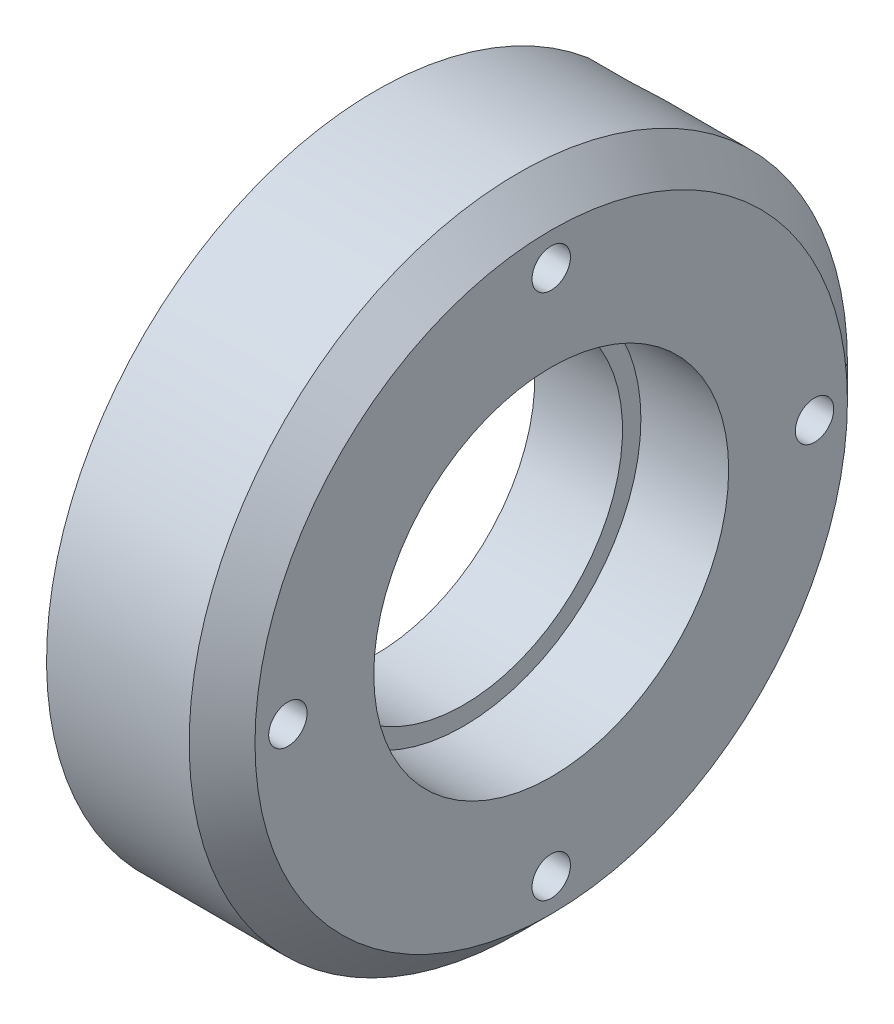
ISO-10303-21;
HEADER;
FILE_DESCRIPTION(('STEP AP214'),'2;1');
FILE_NAME('part.step','',(''),(''),'','','');
FILE_SCHEMA(('AUTOMOTIVE_DESIGN { 1 0 10303 214 1 1 1 1 }'));
ENDSEC;
DATA;
#1=APPLICATION_CONTEXT('core data for automotive mechanical design processes');
#2=APPLICATION_PROTOCOL_DEFINITION('international standard','automotive_design',2000,#1);
#3=PRODUCT_CONTEXT('',#1,'mechanical');
#4=PRODUCT('Part','Part','',(#3));
#5=PRODUCT_RELATED_PRODUCT_CATEGORY('part','',(#4));
#6=PRODUCT_DEFINITION_FORMATION('','',#4);
#7=PRODUCT_DEFINITION_CONTEXT('part definition',#1,'design');
#8=PRODUCT_DEFINITION('design','',#6,#7);
#9=PRODUCT_DEFINITION_SHAPE('','',#8);
#10=(LENGTH_UNIT() NAMED_UNIT(*) SI_UNIT(.MILLI.,.METRE.));
#11=(NAMED_UNIT(*) PLANE_ANGLE_UNIT() SI_UNIT($,.RADIAN.));
#12=(NAMED_UNIT(*) SI_UNIT($,.STERADIAN.) SOLID_ANGLE_UNIT());
#13=UNCERTAINTY_MEASURE_WITH_UNIT(LENGTH_MEASURE(1.E-05),#10,'distance_accuracy_value','');
#14=(GEOMETRIC_REPRESENTATION_CONTEXT(3) GLOBAL_UNCERTAINTY_ASSIGNED_CONTEXT((#13)) GLOBAL_UNIT_ASSIGNED_CONTEXT((#10,
#11,#12)) REPRESENTATION_CONTEXT('',''));
#15=CARTESIAN_POINT('',(0.,0.,0.));
#16=DIRECTION('',(0.,0.,1.));
#17=DIRECTION('',(1.,0.,0.));
#18=AXIS2_PLACEMENT_3D('',#15,#16,#17);
#19=CARTESIAN_POINT('',(40.,0.,0.));
#20=DIRECTION('',(-1.,0.,0.));
#21=DIRECTION('',(0.,0.,1.));
#22=AXIS2_PLACEMENT_3D('',#19,#20,#21);
#23=CYLINDRICAL_SURFACE('',#22,16.175);
#24=CARTESIAN_POINT('',(30.,0.,0.));
#25=DIRECTION('',(1.,0.,0.));
#26=DIRECTION('',(0.,0.,-1.));
#27=AXIS2_PLACEMENT_3D('',#24,#25,#26);
#28=CIRCLE('',#27,16.175);
#29=CARTESIAN_POINT('',(30.,0.,-16.175));
#30=VERTEX_POINT('',#29);
#31=EDGE_CURVE('E161',#30,#30,#28,.T.);
#32=ORIENTED_EDGE('',*,*,#31,.T.);
#33=EDGE_LOOP('',(#32));
#34=FACE_BOUND('',#33,.T.);
#35=CARTESIAN_POINT('',(22.,0.,0.));
#36=DIRECTION('',(-1.,0.,0.));
#37=DIRECTION('',(0.,0.,1.));
#38=AXIS2_PLACEMENT_3D('',#35,#36,#37);
#39=CIRCLE('',#38,16.175);
#40=CARTESIAN_POINT('',(22.,0.,16.175));
#41=VERTEX_POINT('',#40);
#42=EDGE_CURVE('E164',#41,#41,#39,.T.);
#43=ORIENTED_EDGE('',*,*,#42,.T.);
#44=EDGE_LOOP('',(#43));
#45=FACE_BOUND('',#44,.T.);
#46=ADVANCED_FACE('F36',(#34,#45),#23,.F.);
#47=CARTESIAN_POINT('',(40.,0.,0.));
#48=DIRECTION('',(-1.,0.,0.));
#49=DIRECTION('',(0.,0.,1.));
#50=AXIS2_PLACEMENT_3D('',#47,#48,#49);
#51=CYLINDRICAL_SURFACE('',#50,30.);
#52=CARTESIAN_POINT('',(27.,0.,0.));
#53=DIRECTION('',(1.,0.,0.));
#54=DIRECTION('',(0.,0.,-1.));
#55=AXIS2_PLACEMENT_3D('',#52,#53,#54);
#56=CIRCLE('',#55,30.);
#57=CARTESIAN_POINT('',(27.,0.,-30.));
#58=VERTEX_POINT('',#57);
#59=EDGE_CURVE('E181',#58,#58,#56,.F.);
#60=ORIENTED_EDGE('',*,*,#59,.T.);
#61=EDGE_LOOP('',(#60));
#62=FACE_BOUND('',#61,.T.);
#63=CARTESIAN_POINT('',(17.,19.3716512036432,-22.9071851095762));
#64=CARTESIAN_POINT('',(17.0701850028205,19.3716446278736,-22.9071882612013));
#65=CARTESIAN_POINT('',(17.1403666451784,19.3739158061036,-22.9052699670452));
#66=CARTESIAN_POINT('',(17.2802254251884,19.3829633677482,-22.8976154956787));
#67=CARTESIAN_POINT('',(17.3499025932304,19.3897394774612,-22.8918795504134));
#68=CARTESIAN_POINT('',(17.488204811399,19.4077390000801,-22.8766212312019));
#69=CARTESIAN_POINT('',(17.5568307010772,19.4189586489199,-22.8671020619533));
#70=CARTESIAN_POINT('',(17.692582006056,19.4457340512329,-22.8443370022947));
#71=CARTESIAN_POINT('',(17.7597074354787,19.461289763877,-22.8310911469758));
#72=CARTESIAN_POINT('',(17.958176286823,19.5142946363563,-22.7858398679566));
#73=CARTESIAN_POINT('',(18.0866795718545,19.558090382794,-22.7483133061746));
#74=CARTESIAN_POINT('',(18.3321204045051,19.6610253195139,-22.6594059003465));
#75=CARTESIAN_POINT('',(18.4490596101257,19.7201623058258,-22.6080270463223));
#76=CARTESIAN_POINT('',(18.6684535033983,19.8519484215111,-22.4923948201138));
#77=CARTESIAN_POINT('',(18.7708759560693,19.9246268173443,-22.4281135387689));
#78=CARTESIAN_POINT('',(18.9580391716107,20.0810170367262,-22.2881973535121));
#79=CARTESIAN_POINT('',(19.0427772421965,20.1647305371074,-22.212560723862));
#80=CARTESIAN_POINT('',(19.1922684232088,20.3406153462669,-22.0516116374863));
#81=CARTESIAN_POINT('',(19.2569929453064,20.4327985121099,-21.9662855754415));
#82=CARTESIAN_POINT('',(19.3644314414138,20.6226144437533,-21.7881778201045));
#83=CARTESIAN_POINT('',(19.4071471375001,20.7202467825215,-21.695396710788));
#84=CARTESIAN_POINT('',(19.4692657976302,20.9177510057369,-21.5050331520324));
#85=CARTESIAN_POINT('',(19.4887226929871,21.017617160124,-21.40746235822));
#86=CARTESIAN_POINT('',(19.5039381179809,21.2168660114761,-21.2100039112322));
#87=CARTESIAN_POINT('',(19.4996965066672,21.3162487055622,-21.1101162442804));
#88=CARTESIAN_POINT('',(19.4676786321492,21.5114691556099,-20.9111472171078));
#89=CARTESIAN_POINT('',(19.4399610520706,21.607315129476,-20.812064467769));
#90=CARTESIAN_POINT('',(19.3618693723679,21.7931453845252,-20.6173939787849));
#91=CARTESIAN_POINT('',(19.3114951651937,21.8831296378806,-20.5218062557326));
#92=CARTESIAN_POINT('',(19.1894536687989,22.0550461552047,-20.3369346456644));
#93=CARTESIAN_POINT('',(19.1177596639948,22.1369681439988,-20.2476588428089));
#94=CARTESIAN_POINT('',(18.9551363557716,22.290639120905,-20.0783589711186));
#95=CARTESIAN_POINT('',(18.8642075449676,22.3623883694684,-19.9983346654285));
#96=CARTESIAN_POINT('',(18.6653797667402,22.4942473319602,-19.8499053680517));
#97=CARTESIAN_POINT('',(18.5574322089235,22.5543225839599,-19.781534849487));
#98=CARTESIAN_POINT('',(18.3277541651145,22.6612412431664,-19.6589619502575));
#99=CARTESIAN_POINT('',(18.2060194470616,22.7080805720142,-19.6047639369217));
#100=CARTESIAN_POINT('',(17.9521725957926,22.7875056469189,-19.512388753679));
#101=CARTESIAN_POINT('',(17.8200530455419,22.8200810943189,-19.4742231601355));
#102=CARTESIAN_POINT('',(17.5493501086506,22.8701905933769,-19.4153522171289));
#103=CARTESIAN_POINT('',(17.4107768653433,22.887747461102,-19.3946203832984));
#104=CARTESIAN_POINT('',(17.2260404539781,22.9008177417525,-19.3791783903615));
#105=CARTESIAN_POINT('',(17.1808715626238,22.9032069543493,-19.3763545036907));
#106=CARTESIAN_POINT('',(17.0904746702237,22.9063884606105,-19.3725934553239));
#107=CARTESIAN_POINT('',(17.0452468933681,22.9071834107215,-19.3716531550971));
#108=CARTESIAN_POINT('',(17.,22.907185109576,-19.3716512036435));
#109=B_SPLINE_CURVE_WITH_KNOTS('',3,(#63,#64,#65,#66,#67,#68,#69,#70,#71,#72,#73,#74,#75,#76,
#77,#78,#79,#80,#81,#82,#83,#84,#85,#86,#87,#88,#89,#90,#91,#92,#93,#94,#95,#96,#97,#98,#99,
#100,#101,#102,#103,#104,#105,#106,#107,#108),.UNSPECIFIED.,.F.,.F.,(4,2,2,2,2,2,2,2,2,2,2,2,2,
2,2,2,2,2,2,2,2,2,4),(0.,0.210486047255995,0.420959307396837,0.631254658321439,
0.841548029138379,1.26193249701665,1.68225660456235,2.10349990553541,2.52480729022185,
2.94671374001897,3.36858717281008,3.78948047781996,4.21037628615937,4.63022307147192,
5.05007184979883,5.47044896860687,5.89081532260681,6.31240436055815,6.73412316061267,
7.15614594555505,7.57752645352452,7.71343882322753,7.84912453957709),.UNSPECIFIED.);
#110=CARTESIAN_POINT('',(17.,19.3716512036432,-22.9071851095762));
#111=VERTEX_POINT('',#110);
#112=CARTESIAN_POINT('',(17.,22.907185109576,-19.3716512036435));
#113=VERTEX_POINT('',#112);
#114=EDGE_CURVE('E83',#111,#113,#109,.T.);
#115=ORIENTED_EDGE('',*,*,#114,.T.);
#116=DIRECTION('',(-1.,0.,0.));
#117=VECTOR('',#116,1.);
#118=CARTESIAN_POINT('',(40.,22.907185109576,-19.3716512036435));
#119=LINE('',#118,#117);
#120=CARTESIAN_POINT('',(14.,22.907185109576,-19.3716512036435));
#121=VERTEX_POINT('',#120);
#122=EDGE_CURVE('E90',#113,#121,#119,.T.);
#123=ORIENTED_EDGE('',*,*,#122,.T.);
#124=CARTESIAN_POINT('',(14.,0.,0.));
#125=DIRECTION('',(-1.,0.,0.));
#126=DIRECTION('',(0.,0.,1.));
#127=AXIS2_PLACEMENT_3D('',#124,#125,#126);
#128=CIRCLE('',#127,30.);
#129=CARTESIAN_POINT('',(14.,19.3716512036432,-22.9071851095762));
#130=VERTEX_POINT('',#129);
#131=EDGE_CURVE('E99',#130,#121,#128,.T.);
#132=ORIENTED_EDGE('',*,*,#131,.F.);
#133=DIRECTION('',(-1.,0.,0.));
#134=VECTOR('',#133,1.);
#135=CARTESIAN_POINT('',(40.,19.3716512036432,-22.9071851095762));
#136=LINE('',#135,#134);
#137=EDGE_CURVE('E56',#130,#111,#136,.F.);
#138=ORIENTED_EDGE('',*,*,#137,.T.);
#139=EDGE_LOOP('',(#115,#123,#132,#138));
#140=FACE_BOUND('',#139,.T.);
#141=ADVANCED_FACE('F97',(#62,#140),#51,.T.);
#142=CARTESIAN_POINT('',(5.,0.,24.));
#143=DIRECTION('',(1.,0.,0.));
#144=DIRECTION('',(0.,0.,-1.));
#145=AXIS2_PLACEMENT_3D('',#142,#143,#144);
#146=CYLINDRICAL_SURFACE('',#145,1.75);
#147=CARTESIAN_POINT('',(30.,0.,24.));
#148=DIRECTION('',(1.,0.,0.));
#149=DIRECTION('',(0.,0.,-1.));
#150=AXIS2_PLACEMENT_3D('',#147,#148,#149);
#151=CIRCLE('',#150,1.75);
#152=CARTESIAN_POINT('',(30.,0.,22.25));
#153=VERTEX_POINT('',#152);
#154=EDGE_CURVE('E198',#153,#153,#151,.T.);
#155=CARTESIAN_POINT('',(14.,0.,24.));
#156=DIRECTION('',(-1.,0.,0.));
#157=DIRECTION('',(0.,0.,1.));
#158=AXIS2_PLACEMENT_3D('',#155,#156,#157);
#159=CIRCLE('',#158,1.75);
#160=CARTESIAN_POINT('',(14.,0.,22.25));
#161=VERTEX_POINT('',#160);
#162=EDGE_CURVE('E206',#161,#161,#159,.T.);
#163=CARTESIAN_POINT('',(30.,0.,22.25));
#164=CARTESIAN_POINT('',(29.8333333333333,0.,22.25));
#165=CARTESIAN_POINT('',(29.6666666666667,0.,22.25));
#166=CARTESIAN_POINT('',(29.3333333333333,0.,22.25));
#167=CARTESIAN_POINT('',(29.1666666666667,0.,22.25));
#168=CARTESIAN_POINT('',(28.8333333333333,0.,22.25));
#169=CARTESIAN_POINT('',(28.6666666666667,0.,22.25));
#170=CARTESIAN_POINT('',(28.3333333333333,0.,22.25));
#171=CARTESIAN_POINT('',(28.1666666666667,0.,22.25));
#172=CARTESIAN_POINT('',(27.8333333333333,0.,22.25));
#173=CARTESIAN_POINT('',(27.6666666666667,0.,22.25));
#174=CARTESIAN_POINT('',(27.3333333333333,0.,22.25));
#175=CARTESIAN_POINT('',(27.1666666666667,0.,22.25));
#176=CARTESIAN_POINT('',(26.8333333333333,0.,22.25));
#177=CARTESIAN_POINT('',(26.6666666666667,0.,22.25));
#178=CARTESIAN_POINT('',(26.3333333333333,0.,22.25));
#179=CARTESIAN_POINT('',(26.1666666666667,0.,22.25));
#180=CARTESIAN_POINT('',(25.8333333333333,0.,22.25));
#181=CARTESIAN_POINT('',(25.6666666666667,0.,22.25));
#182=CARTESIAN_POINT('',(25.3333333333333,0.,22.25));
#183=CARTESIAN_POINT('',(25.1666666666667,0.,22.25));
#184=CARTESIAN_POINT('',(24.8333333333333,0.,22.25));
#185=CARTESIAN_POINT('',(24.6666666666667,0.,22.25));
#186=CARTESIAN_POINT('',(24.3333333333333,0.,22.25));
#187=CARTESIAN_POINT('',(24.1666666666667,0.,22.25));
#188=CARTESIAN_POINT('',(23.8333333333333,0.,22.25));
#189=CARTESIAN_POINT('',(23.6666666666667,0.,22.25));
#190=CARTESIAN_POINT('',(23.3333333333333,0.,22.25));
#191=CARTESIAN_POINT('',(23.1666666666667,0.,22.25));
#192=CARTESIAN_POINT('',(22.8333333333333,0.,22.25));
#193=CARTESIAN_POINT('',(22.6666666666667,0.,22.25));
#194=CARTESIAN_POINT('',(22.3333333333333,0.,22.25));
#195=CARTESIAN_POINT('',(22.1666666666667,0.,22.25));
#196=CARTESIAN_POINT('',(21.8333333333333,0.,22.25));
#197=CARTESIAN_POINT('',(21.6666666666667,0.,22.25));
#198=CARTESIAN_POINT('',(21.3333333333333,0.,22.25));
#199=CARTESIAN_POINT('',(21.1666666666667,0.,22.25));
#200=CARTESIAN_POINT('',(20.8333333333333,0.,22.25));
#201=CARTESIAN_POINT('',(20.6666666666667,0.,22.25));
#202=CARTESIAN_POINT('',(20.3333333333333,0.,22.25));
#203=CARTESIAN_POINT('',(20.1666666666667,0.,22.25));
#204=CARTESIAN_POINT('',(19.8333333333333,0.,22.25));
#205=CARTESIAN_POINT('',(19.6666666666667,0.,22.25));
#206=CARTESIAN_POINT('',(19.3333333333333,0.,22.25));
#207=CARTESIAN_POINT('',(19.1666666666667,0.,22.25));
#208=CARTESIAN_POINT('',(18.8333333333333,0.,22.25));
#209=CARTESIAN_POINT('',(18.6666666666667,0.,22.25));
#210=CARTESIAN_POINT('',(18.3333333333333,0.,22.25));
#211=CARTESIAN_POINT('',(18.1666666666667,0.,22.25));
#212=CARTESIAN_POINT('',(17.8333333333333,0.,22.25));
#213=CARTESIAN_POINT('',(17.6666666666667,0.,22.25));
#214=CARTESIAN_POINT('',(17.3333333333333,0.,22.25));
#215=CARTESIAN_POINT('',(17.1666666666667,0.,22.25));
#216=CARTESIAN_POINT('',(16.8333333333333,0.,22.25));
#217=CARTESIAN_POINT('',(16.6666666666667,0.,22.25));
#218=CARTESIAN_POINT('',(16.3333333333333,0.,22.25));
#219=CARTESIAN_POINT('',(16.1666666666667,0.,22.25));
#220=CARTESIAN_POINT('',(15.8333333333333,0.,22.25));
#221=CARTESIAN_POINT('',(15.6666666666667,0.,22.25));
#222=CARTESIAN_POINT('',(15.3333333333333,0.,22.25));
#223=CARTESIAN_POINT('',(15.1666666666667,0.,22.25));
#224=CARTESIAN_POINT('',(14.8333333333333,0.,22.25));
#225=CARTESIAN_POINT('',(14.6666666666667,0.,22.25));
#226=CARTESIAN_POINT('',(14.3333333333333,0.,22.25));
#227=CARTESIAN_POINT('',(14.1666666666667,0.,22.25));
#228=CARTESIAN_POINT('',(14.,0.,22.25));
#229=B_SPLINE_CURVE_WITH_KNOTS('',3,(#163,#164,#165,#166,#167,#168,#169,#170,#171,#172,#173,
#174,#175,#176,#177,#178,#179,#180,#181,#182,#183,#184,#185,#186,#187,#188,#189,#190,#191,#192,
#193,#194,#195,#196,#197,#198,#199,#200,#201,#202,#203,#204,#205,#206,#207,#208,#209,#210,#211,
#212,#213,#214,#215,#216,#217,#218,#219,#220,#221,#222,#223,#224,#225,#226,#227,#228),
.UNSPECIFIED.,.F.,.F.,(4,2,2,2,2,2,2,2,2,2,2,2,2,2,2,2,2,2,2,2,2,2,2,2,2,2,2,2,2,2,2,2,4),(0.,
0.5,1.,1.5,2.,2.5,3.,3.5,4.,4.5,5.,5.5,6.,6.5,7.,7.5,8.,8.5,9.,9.49999999999999,
9.99999999999999,10.5,11.,11.5,12.,12.5,13.,13.5,14.,14.5,15.,15.5,16.),.UNSPECIFIED.);
#230=EDGE_CURVE('BSEAM145',#153,#161,#229,.T.);
#231=ORIENTED_EDGE('',*,*,#154,.T.);
#232=ORIENTED_EDGE('',*,*,#162,.T.);
#233=ORIENTED_EDGE('',*,*,#230,.T.);
#234=ORIENTED_EDGE('',*,*,#230,.F.);
#235=EDGE_LOOP('',(#231,#233,#232,#234));
#236=FACE_BOUND('',#235,.T.);
#237=ADVANCED_FACE('F145',(#236),#146,.F.);
#238=CARTESIAN_POINT('',(5.,24.,0.));
#239=DIRECTION('',(1.,0.,0.));
#240=DIRECTION('',(0.,0.,-1.));
#241=AXIS2_PLACEMENT_3D('',#238,#239,#240);
#242=CYLINDRICAL_SURFACE('',#241,1.75);
#243=CARTESIAN_POINT('',(30.,24.,0.));
#244=DIRECTION('',(1.,0.,0.));
#245=DIRECTION('',(0.,0.,-1.));
#246=AXIS2_PLACEMENT_3D('',#243,#244,#245);
#247=CIRCLE('',#246,1.75);
#248=CARTESIAN_POINT('',(30.,24.,-1.75000000000008));
#249=VERTEX_POINT('',#248);
#250=EDGE_CURVE('E196',#249,#249,#247,.T.);
#251=CARTESIAN_POINT('',(14.,24.,0.));
#252=DIRECTION('',(-1.,0.,0.));
#253=DIRECTION('',(0.,0.,1.));
#254=AXIS2_PLACEMENT_3D('',#251,#252,#253);
#255=CIRCLE('',#254,1.75);
#256=CARTESIAN_POINT('',(14.,24.,-1.75000000000008));
#257=VERTEX_POINT('',#256);
#258=EDGE_CURVE('E207',#257,#257,#255,.T.);
#259=CARTESIAN_POINT('',(30.,24.,-1.75000000000008));
#260=CARTESIAN_POINT('',(29.8333333333333,24.,-1.75000000000008));
#261=CARTESIAN_POINT('',(29.6666666666667,24.,-1.75000000000008));
#262=CARTESIAN_POINT('',(29.3333333333333,24.,-1.75000000000008));
#263=CARTESIAN_POINT('',(29.1666666666667,24.,-1.75000000000008));
#264=CARTESIAN_POINT('',(28.8333333333333,24.,-1.75000000000008));
#265=CARTESIAN_POINT('',(28.6666666666667,24.,-1.75000000000008));
#266=CARTESIAN_POINT('',(28.3333333333333,24.,-1.75000000000008));
#267=CARTESIAN_POINT('',(28.1666666666667,24.,-1.75000000000008));
#268=CARTESIAN_POINT('',(27.8333333333333,24.,-1.75000000000008));
#269=CARTESIAN_POINT('',(27.6666666666667,24.,-1.75000000000008));
#270=CARTESIAN_POINT('',(27.3333333333333,24.,-1.75000000000008));
#271=CARTESIAN_POINT('',(27.1666666666667,24.,-1.75000000000008));
#272=CARTESIAN_POINT('',(26.8333333333333,24.,-1.75000000000008));
#273=CARTESIAN_POINT('',(26.6666666666667,24.,-1.75000000000008));
#274=CARTESIAN_POINT('',(26.3333333333333,24.,-1.75000000000008));
#275=CARTESIAN_POINT('',(26.1666666666667,24.,-1.75000000000008));
#276=CARTESIAN_POINT('',(25.8333333333333,24.,-1.75000000000008));
#277=CARTESIAN_POINT('',(25.6666666666667,24.,-1.75000000000008));
#278=CARTESIAN_POINT('',(25.3333333333333,24.,-1.75000000000008));
#279=CARTESIAN_POINT('',(25.1666666666667,24.,-1.75000000000008));
#280=CARTESIAN_POINT('',(24.8333333333333,24.,-1.75000000000008));
#281=CARTESIAN_POINT('',(24.6666666666667,24.,-1.75000000000008));
#282=CARTESIAN_POINT('',(24.3333333333333,24.,-1.75000000000008));
#283=CARTESIAN_POINT('',(24.1666666666667,24.,-1.75000000000008));
#284=CARTESIAN_POINT('',(23.8333333333333,24.,-1.75000000000008));
#285=CARTESIAN_POINT('',(23.6666666666667,24.,-1.75000000000008));
#286=CARTESIAN_POINT('',(23.3333333333333,24.,-1.75000000000008));
#287=CARTESIAN_POINT('',(23.1666666666667,24.,-1.75000000000008));
#288=CARTESIAN_POINT('',(22.8333333333333,24.,-1.75000000000008));
#289=CARTESIAN_POINT('',(22.6666666666667,24.,-1.75000000000008));
#290=CARTESIAN_POINT('',(22.3333333333333,24.,-1.75000000000008));
#291=CARTESIAN_POINT('',(22.1666666666667,24.,-1.75000000000008));
#292=CARTESIAN_POINT('',(21.8333333333333,24.,-1.75000000000008));
#293=CARTESIAN_POINT('',(21.6666666666667,24.,-1.75000000000008));
#294=CARTESIAN_POINT('',(21.3333333333333,24.,-1.75000000000008));
#295=CARTESIAN_POINT('',(21.1666666666667,24.,-1.75000000000008));
#296=CARTESIAN_POINT('',(20.8333333333333,24.,-1.75000000000008));
#297=CARTESIAN_POINT('',(20.6666666666667,24.,-1.75000000000008));
#298=CARTESIAN_POINT('',(20.3333333333333,24.,-1.75000000000008));
#299=CARTESIAN_POINT('',(20.1666666666667,24.,-1.75000000000008));
#300=CARTESIAN_POINT('',(19.8333333333333,24.,-1.75000000000008));
#301=CARTESIAN_POINT('',(19.6666666666667,24.,-1.75000000000008));
#302=CARTESIAN_POINT('',(19.3333333333333,24.,-1.75000000000008));
#303=CARTESIAN_POINT('',(19.1666666666667,24.,-1.75000000000008));
#304=CARTESIAN_POINT('',(18.8333333333333,24.,-1.75000000000008));
#305=CARTESIAN_POINT('',(18.6666666666667,24.,-1.75000000000008));
#306=CARTESIAN_POINT('',(18.3333333333333,24.,-1.75000000000008));
#307=CARTESIAN_POINT('',(18.1666666666667,24.,-1.75000000000008));
#308=CARTESIAN_POINT('',(17.8333333333333,24.,-1.75000000000008));
#309=CARTESIAN_POINT('',(17.6666666666667,24.,-1.75000000000008));
#310=CARTESIAN_POINT('',(17.3333333333333,24.,-1.75000000000008));
#311=CARTESIAN_POINT('',(17.1666666666667,24.,-1.75000000000008));
#312=CARTESIAN_POINT('',(16.8333333333333,24.,-1.75000000000008));
#313=CARTESIAN_POINT('',(16.6666666666667,24.,-1.75000000000008));
#314=CARTESIAN_POINT('',(16.3333333333333,24.,-1.75000000000008));
#315=CARTESIAN_POINT('',(16.1666666666667,24.,-1.75000000000008));
#316=CARTESIAN_POINT('',(15.8333333333333,24.,-1.75000000000008));
#317=CARTESIAN_POINT('',(15.6666666666667,24.,-1.75000000000008));
#318=CARTESIAN_POINT('',(15.3333333333333,24.,-1.75000000000008));
#319=CARTESIAN_POINT('',(15.1666666666667,24.,-1.75000000000008));
#320=CARTESIAN_POINT('',(14.8333333333333,24.,-1.75000000000008));
#321=CARTESIAN_POINT('',(14.6666666666667,24.,-1.75000000000008));
#322=CARTESIAN_POINT('',(14.3333333333333,24.,-1.75000000000008));
#323=CARTESIAN_POINT('',(14.1666666666667,24.,-1.75000000000008));
#324=CARTESIAN_POINT('',(14.,24.,-1.75000000000008));
#325=B_SPLINE_CURVE_WITH_KNOTS('',3,(#259,#260,#261,#262,#263,#264,#265,#266,#267,#268,#269,
#270,#271,#272,#273,#274,#275,#276,#277,#278,#279,#280,#281,#282,#283,#284,#285,#286,#287,#288,
#289,#290,#291,#292,#293,#294,#295,#296,#297,#298,#299,#300,#301,#302,#303,#304,#305,#306,#307,
#308,#309,#310,#311,#312,#313,#314,#315,#316,#317,#318,#319,#320,#321,#322,#323,#324),
.UNSPECIFIED.,.F.,.F.,(4,2,2,2,2,2,2,2,2,2,2,2,2,2,2,2,2,2,2,2,2,2,2,2,2,2,2,2,2,2,2,2,4),(0.,
0.5,1.,1.5,2.,2.5,3.,3.5,4.,4.5,5.,5.5,6.,6.5,7.,7.5,8.,8.5,9.,9.49999999999999,
9.99999999999999,10.5,11.,11.5,12.,12.5,13.,13.5,14.,14.5,15.,15.5,16.),.UNSPECIFIED.);
#326=EDGE_CURVE('BSEAM141',#249,#257,#325,.T.);
#327=ORIENTED_EDGE('',*,*,#250,.T.);
#328=ORIENTED_EDGE('',*,*,#258,.T.);
#329=ORIENTED_EDGE('',*,*,#326,.T.);
#330=ORIENTED_EDGE('',*,*,#326,.F.);
#331=EDGE_LOOP('',(#327,#329,#328,#330));
#332=FACE_BOUND('',#331,.T.);
#333=ADVANCED_FACE('F141',(#332),#242,.F.);
#334=CARTESIAN_POINT('',(5.,-1.6759110426447E-13,-24.));
#335=DIRECTION('',(1.,0.,0.));
#336=DIRECTION('',(0.,0.,-1.));
#337=AXIS2_PLACEMENT_3D('',#334,#335,#336);
#338=CYLINDRICAL_SURFACE('',#337,1.75);
#339=CARTESIAN_POINT('',(30.,-1.6759110426447E-13,-24.));
#340=DIRECTION('',(1.,0.,0.));
#341=DIRECTION('',(0.,0.,-1.));
#342=AXIS2_PLACEMENT_3D('',#339,#340,#341);
#343=CIRCLE('',#342,1.75);
#344=CARTESIAN_POINT('',(30.,-1.6759110426447E-13,-25.75));
#345=VERTEX_POINT('',#344);
#346=EDGE_CURVE('E170',#345,#345,#343,.T.);
#347=CARTESIAN_POINT('',(14.,-1.6759110426447E-13,-24.));
#348=DIRECTION('',(-1.,0.,0.));
#349=DIRECTION('',(0.,0.,1.));
#350=AXIS2_PLACEMENT_3D('',#347,#348,#349);
#351=CIRCLE('',#350,1.75);
#352=CARTESIAN_POINT('',(14.,-1.6759110426447E-13,-25.75));
#353=VERTEX_POINT('',#352);
#354=EDGE_CURVE('E190',#353,#353,#351,.T.);
#355=CARTESIAN_POINT('',(30.,-1.6759110426447E-13,-25.75));
#356=CARTESIAN_POINT('',(29.8333333333333,-1.6759110426447E-13,-25.75));
#357=CARTESIAN_POINT('',(29.6666666666667,-1.6759110426447E-13,-25.75));
#358=CARTESIAN_POINT('',(29.3333333333333,-1.6759110426447E-13,-25.75));
#359=CARTESIAN_POINT('',(29.1666666666667,-1.6759110426447E-13,-25.75));
#360=CARTESIAN_POINT('',(28.8333333333333,-1.6759110426447E-13,-25.75));
#361=CARTESIAN_POINT('',(28.6666666666667,-1.6759110426447E-13,-25.75));
#362=CARTESIAN_POINT('',(28.3333333333333,-1.6759110426447E-13,-25.75));
#363=CARTESIAN_POINT('',(28.1666666666667,-1.6759110426447E-13,-25.75));
#364=CARTESIAN_POINT('',(27.8333333333333,-1.6759110426447E-13,-25.75));
#365=CARTESIAN_POINT('',(27.6666666666667,-1.6759110426447E-13,-25.75));
#366=CARTESIAN_POINT('',(27.3333333333333,-1.6759110426447E-13,-25.75));
#367=CARTESIAN_POINT('',(27.1666666666667,-1.6759110426447E-13,-25.75));
#368=CARTESIAN_POINT('',(26.8333333333333,-1.6759110426447E-13,-25.75));
#369=CARTESIAN_POINT('',(26.6666666666667,-1.6759110426447E-13,-25.75));
#370=CARTESIAN_POINT('',(26.3333333333333,-1.6759110426447E-13,-25.75));
#371=CARTESIAN_POINT('',(26.1666666666667,-1.6759110426447E-13,-25.75));
#372=CARTESIAN_POINT('',(25.8333333333333,-1.6759110426447E-13,-25.75));
#373=CARTESIAN_POINT('',(25.6666666666667,-1.6759110426447E-13,-25.75));
#374=CARTESIAN_POINT('',(25.3333333333333,-1.6759110426447E-13,-25.75));
#375=CARTESIAN_POINT('',(25.1666666666667,-1.6759110426447E-13,-25.75));
#376=CARTESIAN_POINT('',(24.8333333333333,-1.6759110426447E-13,-25.75));
#377=CARTESIAN_POINT('',(24.6666666666667,-1.6759110426447E-13,-25.75));
#378=CARTESIAN_POINT('',(24.3333333333333,-1.6759110426447E-13,-25.75));
#379=CARTESIAN_POINT('',(24.1666666666667,-1.6759110426447E-13,-25.75));
#380=CARTESIAN_POINT('',(23.8333333333333,-1.6759110426447E-13,-25.75));
#381=CARTESIAN_POINT('',(23.6666666666667,-1.6759110426447E-13,-25.75));
#382=CARTESIAN_POINT('',(23.3333333333333,-1.6759110426447E-13,-25.75));
#383=CARTESIAN_POINT('',(23.1666666666667,-1.6759110426447E-13,-25.75));
#384=CARTESIAN_POINT('',(22.8333333333333,-1.6759110426447E-13,-25.75));
#385=CARTESIAN_POINT('',(22.6666666666667,-1.6759110426447E-13,-25.75));
#386=CARTESIAN_POINT('',(22.3333333333333,-1.6759110426447E-13,-25.75));
#387=CARTESIAN_POINT('',(22.1666666666667,-1.6759110426447E-13,-25.75));
#388=CARTESIAN_POINT('',(21.8333333333333,-1.6759110426447E-13,-25.75));
#389=CARTESIAN_POINT('',(21.6666666666667,-1.6759110426447E-13,-25.75));
#390=CARTESIAN_POINT('',(21.3333333333333,-1.6759110426447E-13,-25.75));
#391=CARTESIAN_POINT('',(21.1666666666667,-1.6759110426447E-13,-25.75));
#392=CARTESIAN_POINT('',(20.8333333333333,-1.6759110426447E-13,-25.75));
#393=CARTESIAN_POINT('',(20.6666666666667,-1.6759110426447E-13,-25.75));
#394=CARTESIAN_POINT('',(20.3333333333333,-1.6759110426447E-13,-25.75));
#395=CARTESIAN_POINT('',(20.1666666666667,-1.6759110426447E-13,-25.75));
#396=CARTESIAN_POINT('',(19.8333333333333,-1.6759110426447E-13,-25.75));
#397=CARTESIAN_POINT('',(19.6666666666667,-1.6759110426447E-13,-25.75));
#398=CARTESIAN_POINT('',(19.3333333333333,-1.6759110426447E-13,-25.75));
#399=CARTESIAN_POINT('',(19.1666666666667,-1.6759110426447E-13,-25.75));
#400=CARTESIAN_POINT('',(18.8333333333333,-1.6759110426447E-13,-25.75));
#401=CARTESIAN_POINT('',(18.6666666666667,-1.6759110426447E-13,-25.75));
#402=CARTESIAN_POINT('',(18.3333333333333,-1.6759110426447E-13,-25.75));
#403=CARTESIAN_POINT('',(18.1666666666667,-1.6759110426447E-13,-25.75));
#404=CARTESIAN_POINT('',(17.8333333333333,-1.6759110426447E-13,-25.75));
#405=CARTESIAN_POINT('',(17.6666666666667,-1.6759110426447E-13,-25.75));
#406=CARTESIAN_POINT('',(17.3333333333333,-1.6759110426447E-13,-25.75));
#407=CARTESIAN_POINT('',(17.1666666666667,-1.6759110426447E-13,-25.75));
#408=CARTESIAN_POINT('',(16.8333333333333,-1.6759110426447E-13,-25.75));
#409=CARTESIAN_POINT('',(16.6666666666667,-1.6759110426447E-13,-25.75));
#410=CARTESIAN_POINT('',(16.3333333333333,-1.6759110426447E-13,-25.75));
#411=CARTESIAN_POINT('',(16.1666666666667,-1.6759110426447E-13,-25.75));
#412=CARTESIAN_POINT('',(15.8333333333333,-1.6759110426447E-13,-25.75));
#413=CARTESIAN_POINT('',(15.6666666666667,-1.6759110426447E-13,-25.75));
#414=CARTESIAN_POINT('',(15.3333333333333,-1.6759110426447E-13,-25.75));
#415=CARTESIAN_POINT('',(15.1666666666667,-1.6759110426447E-13,-25.75));
#416=CARTESIAN_POINT('',(14.8333333333333,-1.6759110426447E-13,-25.75));
#417=CARTESIAN_POINT('',(14.6666666666667,-1.6759110426447E-13,-25.75));
#418=CARTESIAN_POINT('',(14.3333333333333,-1.6759110426447E-13,-25.75));
#419=CARTESIAN_POINT('',(14.1666666666667,-1.6759110426447E-13,-25.75));
#420=CARTESIAN_POINT('',(14.,-1.6759110426447E-13,-25.75));
#421=B_SPLINE_CURVE_WITH_KNOTS('',3,(#355,#356,#357,#358,#359,#360,#361,#362,#363,#364,#365,
#366,#367,#368,#369,#370,#371,#372,#373,#374,#375,#376,#377,#378,#379,#380,#381,#382,#383,#384,
#385,#386,#387,#388,#389,#390,#391,#392,#393,#394,#395,#396,#397,#398,#399,#400,#401,#402,#403,
#404,#405,#406,#407,#408,#409,#410,#411,#412,#413,#414,#415,#416,#417,#418,#419,#420),
.UNSPECIFIED.,.F.,.F.,(4,2,2,2,2,2,2,2,2,2,2,2,2,2,2,2,2,2,2,2,2,2,2,2,2,2,2,2,2,2,2,2,4),(0.,
0.5,1.,1.5,2.,2.5,3.,3.5,4.,4.5,5.,5.5,6.,6.5,7.,7.5,8.,8.5,9.,9.49999999999999,
9.99999999999999,10.5,11.,11.5,12.,12.5,13.,13.5,14.,14.5,15.,15.5,16.),.UNSPECIFIED.);
#422=EDGE_CURVE('BSEAM137',#345,#353,#421,.T.);
#423=ORIENTED_EDGE('',*,*,#346,.T.);
#424=ORIENTED_EDGE('',*,*,#354,.T.);
#425=ORIENTED_EDGE('',*,*,#422,.T.);
#426=ORIENTED_EDGE('',*,*,#422,.F.);
#427=EDGE_LOOP('',(#423,#425,#424,#426));
#428=FACE_BOUND('',#427,.T.);
#429=ADVANCED_FACE('F137',(#428),#338,.F.);
#430=CARTESIAN_POINT('',(5.,-24.,2.51386656396706E-13));
#431=DIRECTION('',(1.,0.,0.));
#432=DIRECTION('',(0.,0.,-1.));
#433=AXIS2_PLACEMENT_3D('',#430,#431,#432);
#434=CYLINDRICAL_SURFACE('',#433,1.75);
#435=CARTESIAN_POINT('',(30.,-24.,2.51386656396706E-13));
#436=DIRECTION('',(1.,0.,0.));
#437=DIRECTION('',(0.,0.,-1.));
#438=AXIS2_PLACEMENT_3D('',#435,#436,#437);
#439=CIRCLE('',#438,1.75);
#440=CARTESIAN_POINT('',(30.,-24.,-1.74999999999975));
#441=VERTEX_POINT('',#440);
#442=EDGE_CURVE('E166',#441,#441,#439,.T.);
#443=CARTESIAN_POINT('',(14.,-24.,2.51386656396706E-13));
#444=DIRECTION('',(-1.,0.,0.));
#445=DIRECTION('',(0.,0.,1.));
#446=AXIS2_PLACEMENT_3D('',#443,#444,#445);
#447=CIRCLE('',#446,1.75);
#448=CARTESIAN_POINT('',(14.,-24.,-1.74999999999975));
#449=VERTEX_POINT('',#448);
#450=EDGE_CURVE('E89',#449,#449,#447,.T.);
#451=CARTESIAN_POINT('',(30.,-24.,-1.74999999999975));
#452=CARTESIAN_POINT('',(29.8333333333333,-24.,-1.74999999999975));
#453=CARTESIAN_POINT('',(29.6666666666667,-24.,-1.74999999999975));
#454=CARTESIAN_POINT('',(29.3333333333333,-24.,-1.74999999999975));
#455=CARTESIAN_POINT('',(29.1666666666667,-24.,-1.74999999999975));
#456=CARTESIAN_POINT('',(28.8333333333333,-24.,-1.74999999999975));
#457=CARTESIAN_POINT('',(28.6666666666667,-24.,-1.74999999999975));
#458=CARTESIAN_POINT('',(28.3333333333333,-24.,-1.74999999999975));
#459=CARTESIAN_POINT('',(28.1666666666667,-24.,-1.74999999999975));
#460=CARTESIAN_POINT('',(27.8333333333333,-24.,-1.74999999999975));
#461=CARTESIAN_POINT('',(27.6666666666667,-24.,-1.74999999999975));
#462=CARTESIAN_POINT('',(27.3333333333333,-24.,-1.74999999999975));
#463=CARTESIAN_POINT('',(27.1666666666667,-24.,-1.74999999999975));
#464=CARTESIAN_POINT('',(26.8333333333333,-24.,-1.74999999999975));
#465=CARTESIAN_POINT('',(26.6666666666667,-24.,-1.74999999999975));
#466=CARTESIAN_POINT('',(26.3333333333333,-24.,-1.74999999999975));
#467=CARTESIAN_POINT('',(26.1666666666667,-24.,-1.74999999999975));
#468=CARTESIAN_POINT('',(25.8333333333333,-24.,-1.74999999999975));
#469=CARTESIAN_POINT('',(25.6666666666667,-24.,-1.74999999999975));
#470=CARTESIAN_POINT('',(25.3333333333333,-24.,-1.74999999999975));
#471=CARTESIAN_POINT('',(25.1666666666667,-24.,-1.74999999999975));
#472=CARTESIAN_POINT('',(24.8333333333333,-24.,-1.74999999999975));
#473=CARTESIAN_POINT('',(24.6666666666667,-24.,-1.74999999999975));
#474=CARTESIAN_POINT('',(24.3333333333333,-24.,-1.74999999999975));
#475=CARTESIAN_POINT('',(24.1666666666667,-24.,-1.74999999999975));
#476=CARTESIAN_POINT('',(23.8333333333333,-24.,-1.74999999999975));
#477=CARTESIAN_POINT('',(23.6666666666667,-24.,-1.74999999999975));
#478=CARTESIAN_POINT('',(23.3333333333333,-24.,-1.74999999999975));
#479=CARTESIAN_POINT('',(23.1666666666667,-24.,-1.74999999999975));
#480=CARTESIAN_POINT('',(22.8333333333333,-24.,-1.74999999999975));
#481=CARTESIAN_POINT('',(22.6666666666667,-24.,-1.74999999999975));
#482=CARTESIAN_POINT('',(22.3333333333333,-24.,-1.74999999999975));
#483=CARTESIAN_POINT('',(22.1666666666667,-24.,-1.74999999999975));
#484=CARTESIAN_POINT('',(21.8333333333333,-24.,-1.74999999999975));
#485=CARTESIAN_POINT('',(21.6666666666667,-24.,-1.74999999999975));
#486=CARTESIAN_POINT('',(21.3333333333333,-24.,-1.74999999999975));
#487=CARTESIAN_POINT('',(21.1666666666667,-24.,-1.74999999999975));
#488=CARTESIAN_POINT('',(20.8333333333333,-24.,-1.74999999999975));
#489=CARTESIAN_POINT('',(20.6666666666667,-24.,-1.74999999999975));
#490=CARTESIAN_POINT('',(20.3333333333333,-24.,-1.74999999999975));
#491=CARTESIAN_POINT('',(20.1666666666667,-24.,-1.74999999999975));
#492=CARTESIAN_POINT('',(19.8333333333333,-24.,-1.74999999999975));
#493=CARTESIAN_POINT('',(19.6666666666667,-24.,-1.74999999999975));
#494=CARTESIAN_POINT('',(19.3333333333333,-24.,-1.74999999999975));
#495=CARTESIAN_POINT('',(19.1666666666667,-24.,-1.74999999999975));
#496=CARTESIAN_POINT('',(18.8333333333333,-24.,-1.74999999999975));
#497=CARTESIAN_POINT('',(18.6666666666667,-24.,-1.74999999999975));
#498=CARTESIAN_POINT('',(18.3333333333333,-24.,-1.74999999999975));
#499=CARTESIAN_POINT('',(18.1666666666667,-24.,-1.74999999999975));
#500=CARTESIAN_POINT('',(17.8333333333333,-24.,-1.74999999999975));
#501=CARTESIAN_POINT('',(17.6666666666667,-24.,-1.74999999999975));
#502=CARTESIAN_POINT('',(17.3333333333333,-24.,-1.74999999999975));
#503=CARTESIAN_POINT('',(17.1666666666667,-24.,-1.74999999999975));
#504=CARTESIAN_POINT('',(16.8333333333333,-24.,-1.74999999999975));
#505=CARTESIAN_POINT('',(16.6666666666667,-24.,-1.74999999999975));
#506=CARTESIAN_POINT('',(16.3333333333333,-24.,-1.74999999999975));
#507=CARTESIAN_POINT('',(16.1666666666667,-24.,-1.74999999999975));
#508=CARTESIAN_POINT('',(15.8333333333333,-24.,-1.74999999999975));
#509=CARTESIAN_POINT('',(15.6666666666667,-24.,-1.74999999999975));
#510=CARTESIAN_POINT('',(15.3333333333333,-24.,-1.74999999999975));
#511=CARTESIAN_POINT('',(15.1666666666667,-24.,-1.74999999999975));
#512=CARTESIAN_POINT('',(14.8333333333333,-24.,-1.74999999999975));
#513=CARTESIAN_POINT('',(14.6666666666667,-24.,-1.74999999999975));
#514=CARTESIAN_POINT('',(14.3333333333333,-24.,-1.74999999999975));
#515=CARTESIAN_POINT('',(14.1666666666667,-24.,-1.74999999999975));
#516=CARTESIAN_POINT('',(14.,-24.,-1.74999999999975));
#517=B_SPLINE_CURVE_WITH_KNOTS('',3,(#451,#452,#453,#454,#455,#456,#457,#458,#459,#460,#461,
#462,#463,#464,#465,#466,#467,#468,#469,#470,#471,#472,#473,#474,#475,#476,#477,#478,#479,#480,
#481,#482,#483,#484,#485,#486,#487,#488,#489,#490,#491,#492,#493,#494,#495,#496,#497,#498,#499,
#500,#501,#502,#503,#504,#505,#506,#507,#508,#509,#510,#511,#512,#513,#514,#515,#516),
.UNSPECIFIED.,.F.,.F.,(4,2,2,2,2,2,2,2,2,2,2,2,2,2,2,2,2,2,2,2,2,2,2,2,2,2,2,2,2,2,2,2,4),(0.,
0.5,1.,1.5,2.,2.5,3.,3.5,4.,4.5,5.,5.5,6.,6.5,7.,7.5,8.,8.5,9.,9.49999999999999,
9.99999999999999,10.5,11.,11.5,12.,12.5,13.,13.5,14.,14.5,15.,15.5,16.),.UNSPECIFIED.);
#518=EDGE_CURVE('BSEAM134',#441,#449,#517,.T.);
#519=ORIENTED_EDGE('',*,*,#442,.T.);
#520=ORIENTED_EDGE('',*,*,#450,.T.);
#521=ORIENTED_EDGE('',*,*,#518,.T.);
#522=ORIENTED_EDGE('',*,*,#518,.F.);
#523=EDGE_LOOP('',(#519,#521,#520,#522));
#524=FACE_BOUND('',#523,.T.);
#525=ADVANCED_FACE('F134',(#524),#434,.F.);
#526=CARTESIAN_POINT('',(30.,0.,0.));
#527=DIRECTION('',(1.,0.,0.));
#528=DIRECTION('',(0.,0.,-1.));
#529=AXIS2_PLACEMENT_3D('',#526,#527,#528);
#530=PLANE('',#529);
#531=CARTESIAN_POINT('',(30.,0.,0.));
#532=DIRECTION('',(1.,0.,0.));
#533=DIRECTION('',(0.,0.,-1.));
#534=AXIS2_PLACEMENT_3D('',#531,#532,#533);
#535=CIRCLE('',#534,27.);
#536=CARTESIAN_POINT('',(30.,0.,-27.));
#537=VERTEX_POINT('',#536);
#538=EDGE_CURVE('E178',#537,#537,#535,.T.);
#539=ORIENTED_EDGE('',*,*,#538,.T.);
#540=EDGE_LOOP('',(#539));
#541=FACE_BOUND('',#540,.T.);
#542=ORIENTED_EDGE('',*,*,#442,.F.);
#543=EDGE_LOOP('',(#542));
#544=FACE_BOUND('',#543,.T.);
#545=ORIENTED_EDGE('',*,*,#346,.F.);
#546=EDGE_LOOP('',(#545));
#547=FACE_BOUND('',#546,.T.);
#548=ORIENTED_EDGE('',*,*,#250,.F.);
#549=EDGE_LOOP('',(#548));
#550=FACE_BOUND('',#549,.T.);
#551=ORIENTED_EDGE('',*,*,#154,.F.);
#552=EDGE_LOOP('',(#551));
#553=FACE_BOUND('',#552,.T.);
#554=ORIENTED_EDGE('',*,*,#31,.F.);
#555=EDGE_LOOP('',(#554));
#556=FACE_BOUND('',#555,.T.);
#557=ADVANCED_FACE('F132',(#541,#544,#547,#550,#553,#556),#530,.T.);
#558=CARTESIAN_POINT('',(22.,0.,0.));
#559=DIRECTION('',(-1.,0.,0.));
#560=DIRECTION('',(0.,0.,1.));
#561=AXIS2_PLACEMENT_3D('',#558,#559,#560);
#562=PLANE('',#561);
#563=CARTESIAN_POINT('',(22.,0.,0.));
#564=DIRECTION('',(-1.,0.,0.));
#565=DIRECTION('',(0.,0.,1.));
#566=AXIS2_PLACEMENT_3D('',#563,#564,#565);
#567=CIRCLE('',#566,14.5);
#568=CARTESIAN_POINT('',(22.,0.,14.5));
#569=VERTEX_POINT('',#568);
#570=EDGE_CURVE('E167',#569,#569,#567,.T.);
#571=ORIENTED_EDGE('',*,*,#570,.T.);
#572=EDGE_LOOP('',(#571));
#573=FACE_BOUND('',#572,.T.);
#574=ORIENTED_EDGE('',*,*,#42,.F.);
#575=EDGE_LOOP('',(#574));
#576=FACE_BOUND('',#575,.T.);
#577=ADVANCED_FACE('F128',(#573,#576),#562,.F.);
#578=CARTESIAN_POINT('',(22.,0.,0.));
#579=DIRECTION('',(-1.,0.,0.));
#580=DIRECTION('',(0.,0.,1.));
#581=AXIS2_PLACEMENT_3D('',#578,#579,#580);
#582=CYLINDRICAL_SURFACE('',#581,14.5);
#583=ORIENTED_EDGE('',*,*,#570,.F.);
#584=EDGE_LOOP('',(#583));
#585=FACE_BOUND('',#584,.T.);
#586=CARTESIAN_POINT('',(14.,0.,0.));
#587=DIRECTION('',(-1.,0.,0.));
#588=DIRECTION('',(0.,0.,1.));
#589=AXIS2_PLACEMENT_3D('',#586,#587,#588);
#590=CIRCLE('',#589,14.5);
#591=CARTESIAN_POINT('',(14.,8.33173798539564,-11.8672718913285));
#592=VERTEX_POINT('',#591);
#593=CARTESIAN_POINT('',(14.,11.8672718913284,-8.33173798539577));
#594=VERTEX_POINT('',#593);
#595=EDGE_CURVE('E173',#592,#594,#590,.T.);
#596=ORIENTED_EDGE('',*,*,#595,.T.);
#597=DIRECTION('',(-1.,0.,0.));
#598=VECTOR('',#597,1.);
#599=CARTESIAN_POINT('',(22.,11.8672718913284,-8.33173798539577));
#600=LINE('',#599,#598);
#601=CARTESIAN_POINT('',(17.,11.8672718913284,-8.33173798539577));
#602=VERTEX_POINT('',#601);
#603=EDGE_CURVE('E100',#594,#602,#600,.F.);
#604=ORIENTED_EDGE('',*,*,#603,.T.);
#605=CARTESIAN_POINT('',(17.,11.8672718913284,-8.33173798539577));
#606=CARTESIAN_POINT('',(17.06975766737,11.8672734517522,-8.33172916038112));
#607=CARTESIAN_POINT('',(17.1395114192909,11.8655687016216,-8.334163746399));
#608=CARTESIAN_POINT('',(17.2785094644041,11.8587599592371,-8.34385261045669));
#609=CARTESIAN_POINT('',(17.3477538097394,11.8536563199314,-8.35110638806077));
#610=CARTESIAN_POINT('',(17.4851559836648,11.8400720828363,-8.37035390686539));
#611=CARTESIAN_POINT('',(17.5533151175958,11.8315959207459,-8.38234142187891));
#612=CARTESIAN_POINT('',(17.6881364331937,11.8113011947687,-8.41091365232583));
#613=CARTESIAN_POINT('',(17.75479861516,11.7994826315502,-8.42749836683994));
#614=CARTESIAN_POINT('',(17.9518648157361,11.7590519982034,-8.48391830389336));
#615=CARTESIAN_POINT('',(18.0794441185069,11.7254555889445,-8.53043293842093));
#616=CARTESIAN_POINT('',(18.323223482248,11.6454572114292,-8.63932055065485));
#617=CARTESIAN_POINT('',(18.4394232298986,11.5990548907147,-8.70169396483991));
#618=CARTESIAN_POINT('',(18.6584415259963,11.4935643191288,-8.84056752928132));
#619=CARTESIAN_POINT('',(18.7611251959554,11.4343618110189,-8.91719398311658));
#620=CARTESIAN_POINT('',(18.949008587788,11.3044207876454,-9.08135501185065));
#621=CARTESIAN_POINT('',(19.0342056256437,11.2336805044381,-9.16889125798105));
#622=CARTESIAN_POINT('',(19.1852062948397,11.0814045534671,-9.35236623581649));
#623=CARTESIAN_POINT('',(19.250882626796,10.9998028415387,-9.44835504839271));
#624=CARTESIAN_POINT('',(19.3601536202017,10.827843823026,-9.64493804364967));
#625=CARTESIAN_POINT('',(19.4037510632108,10.7374876210662,-9.74553164446441));
#626=CARTESIAN_POINT('',(19.4672140945437,10.551103800144,-9.94700189769197));
#627=CARTESIAN_POINT('',(19.4873091643661,10.4551407958028,-10.0478660068905));
#628=CARTESIAN_POINT('',(19.503910972105,10.2593160153539,-10.247731521133));
#629=CARTESIAN_POINT('',(19.5004188631377,10.159454430075,-10.3467330169981));
#630=CARTESIAN_POINT('',(19.4701227902565,9.95983932591638,-10.5390042388754));
#631=CARTESIAN_POINT('',(19.4435664488091,9.86009589267274,-10.6323236171672));
#632=CARTESIAN_POINT('',(19.3682862774626,9.66273402667649,-10.8120022510604));
#633=CARTESIAN_POINT('',(19.3195618805231,9.56511564834793,-10.8983613285566));
#634=CARTESIAN_POINT('',(19.201084434017,9.37467744006394,-11.0626094676183));
#635=CARTESIAN_POINT('',(19.1312297943257,9.28188338830926,-11.1404550797165));
#636=CARTESIAN_POINT('',(18.9725517007876,9.10472627016849,-11.2857034250137));
#637=CARTESIAN_POINT('',(18.8837272968692,9.02036362636723,-11.3531056348792));
#638=CARTESIAN_POINT('',(18.6882735287602,8.86200664815558,-11.4771557637663));
#639=CARTESIAN_POINT('',(18.5814298914492,8.7881595948547,-11.5336542428379));
#640=CARTESIAN_POINT('',(18.3536488756797,8.65491133006715,-11.6339800067413));
#641=CARTESIAN_POINT('',(18.23270751507,8.59551421491816,-11.6778036991272));
#642=CARTESIAN_POINT('',(17.9798944296224,8.4934773319498,-11.7522276278819));
#643=CARTESIAN_POINT('',(17.8480031258423,8.45086839888112,-11.7828035423052));
#644=CARTESIAN_POINT('',(17.5773093989218,8.38442876781106,-11.8301752875627));
#645=CARTESIAN_POINT('',(17.4385176312234,8.36057001872795,-11.8469917047534));
#646=CARTESIAN_POINT('',(17.2488845773395,8.34163555613731,-11.8603176528864));
#647=CARTESIAN_POINT('',(17.1991719735139,8.33792319232712,-11.8629272879633));
#648=CARTESIAN_POINT('',(17.0996468640213,8.33297750312788,-11.866402033348));
#649=CARTESIAN_POINT('',(17.0498346680113,8.33174000946654,-11.8672700769198));
#650=CARTESIAN_POINT('',(17.,8.33173798539564,-11.8672718913285));
#651=B_SPLINE_CURVE_WITH_KNOTS('',3,(#605,#606,#607,#608,#609,#610,#611,#612,#613,#614,#615,
#616,#617,#618,#619,#620,#621,#622,#623,#624,#625,#626,#627,#628,#629,#630,#631,#632,#633,#634,
#635,#636,#637,#638,#639,#640,#641,#642,#643,#644,#645,#646,#647,#648,#649,#650),.UNSPECIFIED.,
.F.,.F.,(4,2,2,2,2,2,2,2,2,2,2,2,2,2,2,2,2,2,2,2,2,2,4),(0.,0.209202823640739,0.418383926582975,
0.627290809471151,0.836197650584576,1.25372384646618,1.6712615351003,2.09269261723487,
2.51418833640362,2.93837528827424,3.36250878659261,3.78246544772098,4.20240157840232,
4.61788415172048,5.03337735333043,5.45090080280775,5.86844516820826,6.29135891405442,
6.71439241017478,7.13819930720871,7.56137095747759,7.71105951863722,7.86049575548058),.UNSPECIFIED.);
#652=CARTESIAN_POINT('',(17.,8.33173798539564,-11.8672718913285));
#653=VERTEX_POINT('',#652);
#654=EDGE_CURVE('E11',#602,#653,#651,.T.);
#655=ORIENTED_EDGE('',*,*,#654,.T.);
#656=DIRECTION('',(-1.,0.,0.));
#657=VECTOR('',#656,1.);
#658=CARTESIAN_POINT('',(22.,8.33173798539564,-11.8672718913285));
#659=LINE('',#658,#657);
#660=EDGE_CURVE('E94',#653,#592,#659,.T.);
#661=ORIENTED_EDGE('',*,*,#660,.T.);
#662=EDGE_LOOP('',(#596,#604,#655,#661));
#663=FACE_BOUND('',#662,.T.);
#664=ADVANCED_FACE('F123',(#585,#663),#582,.F.);
#665=CARTESIAN_POINT('',(14.,0.,0.));
#666=DIRECTION('',(-1.,0.,0.));
#667=DIRECTION('',(0.,0.,1.));
#668=AXIS2_PLACEMENT_3D('',#665,#666,#667);
#669=PLANE('',#668);
#670=DIRECTION('',(0.,0.707106781186544,-0.707106781186551));
#671=VECTOR('',#670,1.);
#672=CARTESIAN_POINT('',(14.,1.76776695296638,1.76776695296636));
#673=LINE('',#672,#671);
#674=EDGE_CURVE('E49',#594,#121,#673,.T.);
#675=ORIENTED_EDGE('',*,*,#674,.F.);
#676=ORIENTED_EDGE('',*,*,#595,.F.);
#677=DIRECTION('',(0.,-0.707106781186544,0.707106781186551));
#678=VECTOR('',#677,1.);
#679=CARTESIAN_POINT('',(14.,-1.76776695296638,-1.76776695296636));
#680=LINE('',#679,#678);
#681=EDGE_CURVE('E184',#130,#592,#680,.T.);
#682=ORIENTED_EDGE('',*,*,#681,.F.);
#683=ORIENTED_EDGE('',*,*,#131,.T.);
#684=EDGE_LOOP('',(#675,#676,#682,#683));
#685=FACE_BOUND('',#684,.T.);
#686=ORIENTED_EDGE('',*,*,#162,.F.);
#687=EDGE_LOOP('',(#686));
#688=FACE_BOUND('',#687,.T.);
#689=ORIENTED_EDGE('',*,*,#354,.F.);
#690=EDGE_LOOP('',(#689));
#691=FACE_BOUND('',#690,.T.);
#692=ORIENTED_EDGE('',*,*,#258,.F.);
#693=EDGE_LOOP('',(#692));
#694=FACE_BOUND('',#693,.T.);
#695=ORIENTED_EDGE('',*,*,#450,.F.);
#696=EDGE_LOOP('',(#695));
#697=FACE_BOUND('',#696,.T.);
#698=ADVANCED_FACE('F121',(#685,#688,#691,#694,#697),#669,.T.);
#699=CARTESIAN_POINT('',(30.,0.,0.));
#700=DIRECTION('',(-1.,0.,0.));
#701=DIRECTION('',(0.,0.,1.));
#702=AXIS2_PLACEMENT_3D('',#699,#700,#701);
#703=CONICAL_SURFACE('',#702,27.,0.785398163397448);
#704=ORIENTED_EDGE('',*,*,#59,.F.);
#705=EDGE_LOOP('',(#704));
#706=FACE_BOUND('',#705,.T.);
#707=ORIENTED_EDGE('',*,*,#538,.F.);
#708=EDGE_LOOP('',(#707));
#709=FACE_BOUND('',#708,.T.);
#710=ADVANCED_FACE('F38',(#706,#709),#703,.T.);
#711=CARTESIAN_POINT('',(17.,29.9999999999998,-30.0000000000002));
#712=DIRECTION('',(0.,-0.707106781186544,0.707106781186551));
#713=DIRECTION('',(0.,-0.707106781186551,-0.707106781186544));
#714=AXIS2_PLACEMENT_3D('',#711,#712,#713);
#715=CYLINDRICAL_SURFACE('',#714,2.5);
#716=DIRECTION('',(0.,-0.707106781186544,0.707106781186551));
#717=VECTOR('',#716,1.);
#718=CARTESIAN_POINT('',(17.,28.2322330470335,-31.7677669529665));
#719=LINE('',#718,#717);
#720=EDGE_CURVE('E85',#111,#653,#719,.T.);
#721=ORIENTED_EDGE('',*,*,#720,.T.);
#722=ORIENTED_EDGE('',*,*,#654,.F.);
#723=DIRECTION('',(0.,-0.707106781186544,0.707106781186551));
#724=VECTOR('',#723,1.);
#725=CARTESIAN_POINT('',(17.,31.7677669529662,-28.2322330470338));
#726=LINE('',#725,#724);
#727=EDGE_CURVE('E87',#113,#602,#726,.T.);
#728=ORIENTED_EDGE('',*,*,#727,.F.);
#729=ORIENTED_EDGE('',*,*,#114,.F.);
#730=EDGE_LOOP('',(#721,#722,#728,#729));
#731=FACE_BOUND('',#730,.T.);
#732=ADVANCED_FACE('F84',(#731),#715,.F.);
#733=CARTESIAN_POINT('',(12.,31.7677669529662,-28.2322330470338));
#734=DIRECTION('',(0.,0.707106781186551,0.707106781186544));
#735=DIRECTION('',(0.,-0.707106781186544,0.707106781186551));
#736=AXIS2_PLACEMENT_3D('',#733,#734,#735);
#737=PLANE('',#736);
#738=ORIENTED_EDGE('',*,*,#727,.T.);
#739=ORIENTED_EDGE('',*,*,#603,.F.);
#740=ORIENTED_EDGE('',*,*,#674,.T.);
#741=ORIENTED_EDGE('',*,*,#122,.F.);
#742=EDGE_LOOP('',(#738,#739,#740,#741));
#743=FACE_BOUND('',#742,.T.);
#744=ADVANCED_FACE('F117',(#743),#737,.F.);
#745=CARTESIAN_POINT('',(12.,28.2322330470335,-31.7677669529665));
#746=DIRECTION('',(0.,-0.707106781186551,-0.707106781186544));
#747=DIRECTION('',(0.,0.707106781186544,-0.707106781186551));
#748=AXIS2_PLACEMENT_3D('',#745,#746,#747);
#749=PLANE('',#748);
#750=ORIENTED_EDGE('',*,*,#681,.T.);
#751=ORIENTED_EDGE('',*,*,#660,.F.);
#752=ORIENTED_EDGE('',*,*,#720,.F.);
#753=ORIENTED_EDGE('',*,*,#137,.F.);
#754=EDGE_LOOP('',(#750,#751,#752,#753));
#755=FACE_BOUND('',#754,.T.);
#756=ADVANCED_FACE('F92',(#755),#749,.F.);
#757=CLOSED_SHELL('',(#46,#141,#237,#333,#429,#525,#557,#577,#664,#698,#710,#732,#744,#756));
#758=MANIFOLD_SOLID_BREP('B2',#757);
#759=ADVANCED_BREP_SHAPE_REPRESENTATION('',(#18,#758),#14);
#760=SHAPE_DEFINITION_REPRESENTATION(#9,#759);
ENDSEC;
END-ISO-10303-21;
